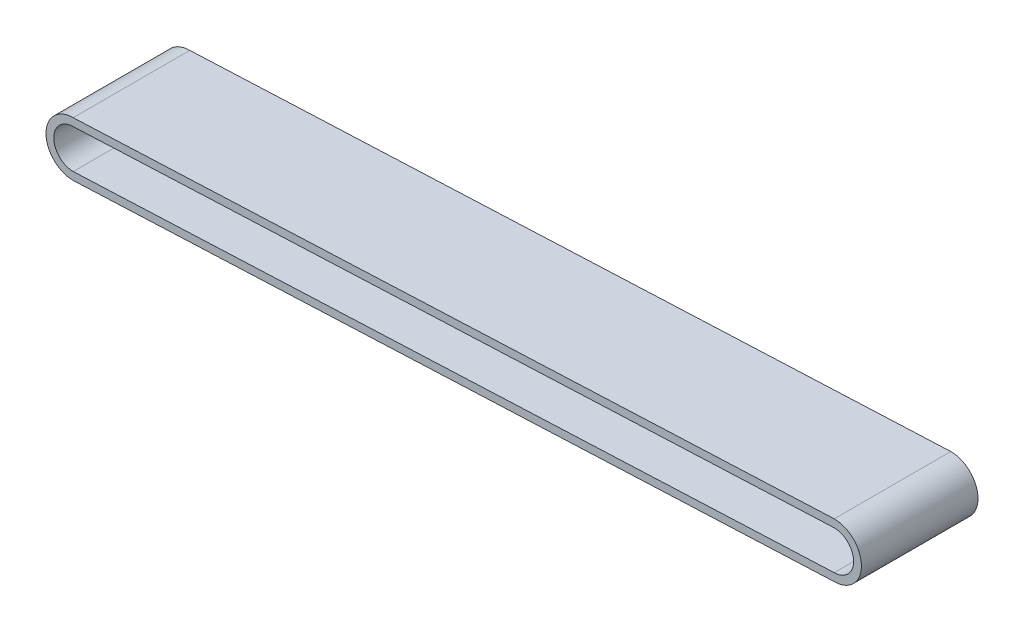
ISO-10303-21;
HEADER;
FILE_DESCRIPTION(('STEP AP214'),'2;1');
FILE_NAME('part.step','',(''),(''),'','','');
FILE_SCHEMA(('AUTOMOTIVE_DESIGN { 1 0 10303 214 1 1 1 1 }'));
ENDSEC;
DATA;
#1=APPLICATION_CONTEXT('core data for automotive mechanical design processes');
#2=APPLICATION_PROTOCOL_DEFINITION('international standard','automotive_design',2000,#1);
#3=PRODUCT_CONTEXT('',#1,'mechanical');
#4=PRODUCT('Part','Part','',(#3));
#5=PRODUCT_RELATED_PRODUCT_CATEGORY('part','',(#4));
#6=PRODUCT_DEFINITION_FORMATION('','',#4);
#7=PRODUCT_DEFINITION_CONTEXT('part definition',#1,'design');
#8=PRODUCT_DEFINITION('design','',#6,#7);
#9=PRODUCT_DEFINITION_SHAPE('','',#8);
#10=(LENGTH_UNIT() NAMED_UNIT(*) SI_UNIT(.MILLI.,.METRE.));
#11=(NAMED_UNIT(*) PLANE_ANGLE_UNIT() SI_UNIT($,.RADIAN.));
#12=(NAMED_UNIT(*) SI_UNIT($,.STERADIAN.) SOLID_ANGLE_UNIT());
#13=UNCERTAINTY_MEASURE_WITH_UNIT(LENGTH_MEASURE(1.E-05),#10,'distance_accuracy_value','');
#14=(GEOMETRIC_REPRESENTATION_CONTEXT(3) GLOBAL_UNCERTAINTY_ASSIGNED_CONTEXT((#13)) GLOBAL_UNIT_ASSIGNED_CONTEXT((#10,
#11,#12)) REPRESENTATION_CONTEXT('',''));
#15=CARTESIAN_POINT('',(0.,0.,0.));
#16=DIRECTION('',(0.,0.,1.));
#17=DIRECTION('',(1.,0.,0.));
#18=AXIS2_PLACEMENT_3D('',#15,#16,#17);
#19=CARTESIAN_POINT('',(1.1937208885207,-27.4437751339996,75.));
#20=DIRECTION('',(-0.0434558740938504,0.999055347319026,0.));
#21=DIRECTION('',(-0.999055347319026,-0.0434558740938504,0.));
#22=AXIS2_PLACEMENT_3D('',#19,#20,#21);
#23=PLANE('',#22);
#24=DIRECTION('',(0.999055347319026,0.0434558740938504,0.));
#25=VECTOR('',#24,1.);
#26=CARTESIAN_POINT('',(1.1937208885207,-27.4437751339996,0.));
#27=LINE('',#26,#25);
#28=CARTESIAN_POINT('',(-230.,-37.5,0.));
#29=VERTEX_POINT('',#28);
#30=CARTESIAN_POINT('',(259.754203512872,-16.1971792284566,0.));
#31=VERTEX_POINT('',#30);
#32=EDGE_CURVE('E140',#29,#31,#27,.T.);
#33=ORIENTED_EDGE('',*,*,#32,.T.);
#34=DIRECTION('',(0.,0.,-1.));
#35=VECTOR('',#34,1.);
#36=CARTESIAN_POINT('',(259.754203512872,-16.1971792284566,75.));
#37=LINE('',#36,#35);
#38=CARTESIAN_POINT('',(259.754203512872,-16.1971792284566,75.));
#39=VERTEX_POINT('',#38);
#40=EDGE_CURVE('E11',#39,#31,#37,.T.);
#41=ORIENTED_EDGE('',*,*,#40,.F.);
#42=DIRECTION('',(0.999055347319026,0.0434558740938504,0.));
#43=VECTOR('',#42,1.);
#44=CARTESIAN_POINT('',(1.1937208885207,-27.4437751339996,75.));
#45=LINE('',#44,#43);
#46=CARTESIAN_POINT('',(-230.,-37.5,75.));
#47=VERTEX_POINT('',#46);
#48=EDGE_CURVE('E111',#47,#39,#45,.T.);
#49=ORIENTED_EDGE('',*,*,#48,.F.);
#50=DIRECTION('',(0.,0.,-1.));
#51=VECTOR('',#50,1.);
#52=CARTESIAN_POINT('',(-230.,-37.5,75.));
#53=LINE('',#52,#51);
#54=EDGE_CURVE('E148',#47,#29,#53,.T.);
#55=ORIENTED_EDGE('',*,*,#54,.T.);
#56=EDGE_LOOP('',(#33,#41,#49,#55));
#57=FACE_BOUND('',#56,.T.);
#58=ADVANCED_FACE('F34',(#57),#23,.F.);
#59=CARTESIAN_POINT('',(259.536768158874,1.30146991560114,75.));
#60=DIRECTION('',(0.,0.,-1.));
#61=DIRECTION('',(-1.,0.,0.));
#62=AXIS2_PLACEMENT_3D('',#59,#60,#61);
#63=CYLINDRICAL_SURFACE('',#62,17.5);
#64=CARTESIAN_POINT('',(259.536768158874,1.30146991560114,0.));
#65=DIRECTION('',(0.,0.,1.));
#66=DIRECTION('',(1.,0.,0.));
#67=AXIS2_PLACEMENT_3D('',#64,#65,#66);
#68=CIRCLE('',#67,17.5);
#69=CARTESIAN_POINT('',(259.536768158874,18.8014699156011,0.));
#70=VERTEX_POINT('',#69);
#71=EDGE_CURVE('E117',#31,#70,#68,.T.);
#72=ORIENTED_EDGE('',*,*,#71,.T.);
#73=DIRECTION('',(0.,0.,-1.));
#74=VECTOR('',#73,1.);
#75=CARTESIAN_POINT('',(259.536768158874,18.8014699156011,75.));
#76=LINE('',#75,#74);
#77=CARTESIAN_POINT('',(259.536768158874,18.8014699156011,75.));
#78=VERTEX_POINT('',#77);
#79=EDGE_CURVE('E44',#78,#70,#76,.T.);
#80=ORIENTED_EDGE('',*,*,#79,.F.);
#81=CARTESIAN_POINT('',(259.536768158874,1.30146991560114,75.));
#82=DIRECTION('',(0.,0.,1.));
#83=DIRECTION('',(1.,0.,0.));
#84=AXIS2_PLACEMENT_3D('',#81,#82,#83);
#85=CIRCLE('',#84,17.5);
#86=EDGE_CURVE('E105',#39,#78,#85,.T.);
#87=ORIENTED_EDGE('',*,*,#86,.F.);
#88=ORIENTED_EDGE('',*,*,#40,.T.);
#89=EDGE_LOOP('',(#72,#80,#87,#88));
#90=FACE_BOUND('',#89,.T.);
#91=ADVANCED_FACE('F116',(#90),#63,.T.);
#92=CARTESIAN_POINT('',(-0.326086925785996,7.49392133127982,75.));
#93=DIRECTION('',(-0.0434723875828595,0.99905462889566,0.));
#94=DIRECTION('',(-0.99905462889566,-0.0434723875828595,0.));
#95=AXIS2_PLACEMENT_3D('',#92,#93,#94);
#96=PLANE('',#95);
#97=DIRECTION('',(0.999054628895661,0.0434723875828596,0.));
#98=VECTOR('',#97,1.);
#99=CARTESIAN_POINT('',(-0.326086925785996,7.49392133127982,0.));
#100=LINE('',#99,#98);
#101=CARTESIAN_POINT('',(-230.,-2.50000000000004,0.));
#102=VERTEX_POINT('',#101);
#103=EDGE_CURVE('E144',#102,#70,#100,.T.);
#104=ORIENTED_EDGE('',*,*,#103,.F.);
#105=DIRECTION('',(0.,0.,-1.));
#106=VECTOR('',#105,1.);
#107=CARTESIAN_POINT('',(-230.,-2.50000000000004,75.));
#108=LINE('',#107,#106);
#109=CARTESIAN_POINT('',(-230.,-2.50000000000004,75.));
#110=VERTEX_POINT('',#109);
#111=EDGE_CURVE('E81',#110,#102,#108,.T.);
#112=ORIENTED_EDGE('',*,*,#111,.F.);
#113=DIRECTION('',(0.999054628895661,0.0434723875828596,0.));
#114=VECTOR('',#113,1.);
#115=CARTESIAN_POINT('',(-0.326086925785996,7.49392133127982,75.));
#116=LINE('',#115,#114);
#117=EDGE_CURVE('E109',#110,#78,#116,.T.);
#118=ORIENTED_EDGE('',*,*,#117,.T.);
#119=ORIENTED_EDGE('',*,*,#79,.T.);
#120=EDGE_LOOP('',(#104,#112,#118,#119));
#121=FACE_BOUND('',#120,.T.);
#122=ADVANCED_FACE('F122',(#121),#96,.T.);
#123=CARTESIAN_POINT('',(259.536768158874,1.30146991560114,75.));
#124=DIRECTION('',(0.,0.,-1.));
#125=DIRECTION('',(-1.,0.,0.));
#126=AXIS2_PLACEMENT_3D('',#123,#124,#125);
#127=CYLINDRICAL_SURFACE('',#126,12.5);
#128=CARTESIAN_POINT('',(259.536768158874,1.30146991560114,0.));
#129=DIRECTION('',(0.,0.,1.));
#130=DIRECTION('',(1.,0.,0.));
#131=AXIS2_PLACEMENT_3D('',#128,#129,#130);
#132=CIRCLE('',#131,12.5);
#133=CARTESIAN_POINT('',(259.536768158874,-11.1985300843989,0.));
#134=VERTEX_POINT('',#133);
#135=CARTESIAN_POINT('',(259.536768158873,13.8014699156011,0.));
#136=VERTEX_POINT('',#135);
#137=EDGE_CURVE('E128',#134,#136,#132,.T.);
#138=ORIENTED_EDGE('',*,*,#137,.F.);
#139=DIRECTION('',(0.,0.,-1.));
#140=VECTOR('',#139,1.);
#141=CARTESIAN_POINT('',(259.536768158874,-11.1985300843989,75.));
#142=LINE('',#141,#140);
#143=CARTESIAN_POINT('',(259.536768158874,-11.1985300843989,75.));
#144=VERTEX_POINT('',#143);
#145=EDGE_CURVE('E38',#144,#134,#142,.T.);
#146=ORIENTED_EDGE('',*,*,#145,.F.);
#147=CARTESIAN_POINT('',(259.536768158874,1.30146991560114,75.));
#148=DIRECTION('',(0.,0.,1.));
#149=DIRECTION('',(1.,0.,0.));
#150=AXIS2_PLACEMENT_3D('',#147,#148,#149);
#151=CIRCLE('',#150,12.5);
#152=CARTESIAN_POINT('',(259.536768158873,13.8014699156011,75.));
#153=VERTEX_POINT('',#152);
#154=EDGE_CURVE('E147',#144,#153,#151,.T.);
#155=ORIENTED_EDGE('',*,*,#154,.T.);
#156=DIRECTION('',(0.,0.,-1.));
#157=VECTOR('',#156,1.);
#158=CARTESIAN_POINT('',(259.536768158873,13.8014699156011,75.));
#159=LINE('',#158,#157);
#160=EDGE_CURVE('E124',#153,#136,#159,.T.);
#161=ORIENTED_EDGE('',*,*,#160,.T.);
#162=EDGE_LOOP('',(#138,#146,#155,#161));
#163=FACE_BOUND('',#162,.T.);
#164=ADVANCED_FACE('F36',(#163),#127,.F.);
#165=CARTESIAN_POINT('',(0.976851775528066,-22.4493832142556,75.));
#166=DIRECTION('',(-0.0434723875828595,0.99905462889566,0.));
#167=DIRECTION('',(-0.99905462889566,-0.0434723875828595,0.));
#168=AXIS2_PLACEMENT_3D('',#165,#166,#167);
#169=PLANE('',#168);
#170=DIRECTION('',(0.999054628895661,0.0434723875828596,0.));
#171=VECTOR('',#170,1.);
#172=CARTESIAN_POINT('',(0.976851775528066,-22.4493832142556,0.));
#173=LINE('',#172,#171);
#174=CARTESIAN_POINT('',(-230.,-32.5,0.));
#175=VERTEX_POINT('',#174);
#176=EDGE_CURVE('E131',#175,#134,#173,.T.);
#177=ORIENTED_EDGE('',*,*,#176,.F.);
#178=DIRECTION('',(0.,0.,-1.));
#179=VECTOR('',#178,1.);
#180=CARTESIAN_POINT('',(-230.,-32.5,75.));
#181=LINE('',#180,#179);
#182=CARTESIAN_POINT('',(-230.,-32.5,75.));
#183=VERTEX_POINT('',#182);
#184=EDGE_CURVE('E153',#183,#175,#181,.T.);
#185=ORIENTED_EDGE('',*,*,#184,.F.);
#186=DIRECTION('',(0.999054628895661,0.0434723875828596,0.));
#187=VECTOR('',#186,1.);
#188=CARTESIAN_POINT('',(0.976851775528066,-22.4493832142556,75.));
#189=LINE('',#188,#187);
#190=EDGE_CURVE('E162',#183,#144,#189,.T.);
#191=ORIENTED_EDGE('',*,*,#190,.T.);
#192=ORIENTED_EDGE('',*,*,#145,.T.);
#193=EDGE_LOOP('',(#177,#185,#191,#192));
#194=FACE_BOUND('',#193,.T.);
#195=ADVANCED_FACE('F160',(#194),#169,.T.);
#196=CARTESIAN_POINT('',(-230.,-20.,75.));
#197=DIRECTION('',(0.,0.,-1.));
#198=DIRECTION('',(-1.,0.,0.));
#199=AXIS2_PLACEMENT_3D('',#196,#197,#198);
#200=CYLINDRICAL_SURFACE('',#199,12.5);
#201=CARTESIAN_POINT('',(-230.,-20.,0.));
#202=DIRECTION('',(0.,0.,1.));
#203=DIRECTION('',(1.,0.,0.));
#204=AXIS2_PLACEMENT_3D('',#201,#202,#203);
#205=CIRCLE('',#204,12.5);
#206=CARTESIAN_POINT('',(-230.,-7.50000000000004,0.));
#207=VERTEX_POINT('',#206);
#208=EDGE_CURVE('E134',#207,#175,#205,.T.);
#209=ORIENTED_EDGE('',*,*,#208,.F.);
#210=DIRECTION('',(0.,0.,-1.));
#211=VECTOR('',#210,1.);
#212=CARTESIAN_POINT('',(-230.,-7.50000000000004,75.));
#213=LINE('',#212,#211);
#214=CARTESIAN_POINT('',(-230.,-7.50000000000004,75.));
#215=VERTEX_POINT('',#214);
#216=EDGE_CURVE('E152',#215,#207,#213,.T.);
#217=ORIENTED_EDGE('',*,*,#216,.F.);
#218=CARTESIAN_POINT('',(-230.,-20.,75.));
#219=DIRECTION('',(0.,0.,1.));
#220=DIRECTION('',(1.,0.,0.));
#221=AXIS2_PLACEMENT_3D('',#218,#219,#220);
#222=CIRCLE('',#221,12.5);
#223=EDGE_CURVE('E171',#215,#183,#222,.T.);
#224=ORIENTED_EDGE('',*,*,#223,.T.);
#225=ORIENTED_EDGE('',*,*,#184,.T.);
#226=EDGE_LOOP('',(#209,#217,#224,#225));
#227=FACE_BOUND('',#226,.T.);
#228=ADVANCED_FACE('F168',(#227),#200,.F.);
#229=CARTESIAN_POINT('',(-0.108930475566986,2.50337057369059,75.));
#230=DIRECTION('',(-0.0434723875828596,0.99905462889566,0.));
#231=DIRECTION('',(-0.99905462889566,-0.0434723875828596,0.));
#232=AXIS2_PLACEMENT_3D('',#229,#230,#231);
#233=PLANE('',#232);
#234=DIRECTION('',(0.999054628895661,0.0434723875828596,0.));
#235=VECTOR('',#234,1.);
#236=CARTESIAN_POINT('',(-0.108930475566986,2.50337057369059,0.));
#237=LINE('',#236,#235);
#238=EDGE_CURVE('E137',#207,#136,#237,.T.);
#239=ORIENTED_EDGE('',*,*,#238,.T.);
#240=ORIENTED_EDGE('',*,*,#160,.F.);
#241=DIRECTION('',(0.999054628895661,0.0434723875828596,0.));
#242=VECTOR('',#241,1.);
#243=CARTESIAN_POINT('',(-0.108930475566986,2.50337057369059,75.));
#244=LINE('',#243,#242);
#245=EDGE_CURVE('E173',#215,#153,#244,.T.);
#246=ORIENTED_EDGE('',*,*,#245,.F.);
#247=ORIENTED_EDGE('',*,*,#216,.T.);
#248=EDGE_LOOP('',(#239,#240,#246,#247));
#249=FACE_BOUND('',#248,.T.);
#250=ADVANCED_FACE('F174',(#249),#233,.F.);
#251=CARTESIAN_POINT('',(-230.,-20.,75.));
#252=DIRECTION('',(0.,0.,-1.));
#253=DIRECTION('',(-1.,0.,0.));
#254=AXIS2_PLACEMENT_3D('',#251,#252,#253);
#255=CYLINDRICAL_SURFACE('',#254,17.5);
#256=CARTESIAN_POINT('',(-230.,-20.,0.));
#257=DIRECTION('',(0.,0.,1.));
#258=DIRECTION('',(1.,0.,0.));
#259=AXIS2_PLACEMENT_3D('',#256,#257,#258);
#260=CIRCLE('',#259,17.5);
#261=EDGE_CURVE('E84',#102,#29,#260,.T.);
#262=ORIENTED_EDGE('',*,*,#261,.T.);
#263=ORIENTED_EDGE('',*,*,#54,.F.);
#264=CARTESIAN_POINT('',(-230.,-20.,75.));
#265=DIRECTION('',(0.,0.,1.));
#266=DIRECTION('',(1.,0.,0.));
#267=AXIS2_PLACEMENT_3D('',#264,#265,#266);
#268=CIRCLE('',#267,17.5);
#269=EDGE_CURVE('E53',#110,#47,#268,.T.);
#270=ORIENTED_EDGE('',*,*,#269,.F.);
#271=ORIENTED_EDGE('',*,*,#111,.T.);
#272=EDGE_LOOP('',(#262,#263,#270,#271));
#273=FACE_BOUND('',#272,.T.);
#274=ADVANCED_FACE('F181',(#273),#255,.T.);
#275=CARTESIAN_POINT('',(0.,0.,75.));
#276=DIRECTION('',(0.,0.,1.));
#277=DIRECTION('',(1.,0.,0.));
#278=AXIS2_PLACEMENT_3D('',#275,#276,#277);
#279=PLANE('',#278);
#280=ORIENTED_EDGE('',*,*,#154,.F.);
#281=ORIENTED_EDGE('',*,*,#190,.F.);
#282=ORIENTED_EDGE('',*,*,#223,.F.);
#283=ORIENTED_EDGE('',*,*,#245,.T.);
#284=EDGE_LOOP('',(#280,#281,#282,#283));
#285=FACE_BOUND('',#284,.T.);
#286=ORIENTED_EDGE('',*,*,#48,.T.);
#287=ORIENTED_EDGE('',*,*,#86,.T.);
#288=ORIENTED_EDGE('',*,*,#117,.F.);
#289=ORIENTED_EDGE('',*,*,#269,.T.);
#290=EDGE_LOOP('',(#286,#287,#288,#289));
#291=FACE_BOUND('',#290,.T.);
#292=ADVANCED_FACE('F107',(#285,#291),#279,.T.);
#293=CARTESIAN_POINT('',(0.,0.,0.));
#294=DIRECTION('',(0.,0.,1.));
#295=DIRECTION('',(1.,0.,0.));
#296=AXIS2_PLACEMENT_3D('',#293,#294,#295);
#297=PLANE('',#296);
#298=ORIENTED_EDGE('',*,*,#137,.T.);
#299=ORIENTED_EDGE('',*,*,#238,.F.);
#300=ORIENTED_EDGE('',*,*,#208,.T.);
#301=ORIENTED_EDGE('',*,*,#176,.T.);
#302=EDGE_LOOP('',(#298,#299,#300,#301));
#303=FACE_BOUND('',#302,.T.);
#304=ORIENTED_EDGE('',*,*,#32,.F.);
#305=ORIENTED_EDGE('',*,*,#261,.F.);
#306=ORIENTED_EDGE('',*,*,#103,.T.);
#307=ORIENTED_EDGE('',*,*,#71,.F.);
#308=EDGE_LOOP('',(#304,#305,#306,#307));
#309=FACE_BOUND('',#308,.T.);
#310=ADVANCED_FACE('F166',(#303,#309),#297,.F.);
#311=CLOSED_SHELL('',(#58,#91,#122,#164,#195,#228,#250,#274,#292,#310));
#312=MANIFOLD_SOLID_BREP('B2',#311);
#313=ADVANCED_BREP_SHAPE_REPRESENTATION('',(#18,#312),#14);
#314=SHAPE_DEFINITION_REPRESENTATION(#9,#313);
ENDSEC;
END-ISO-10303-21;
